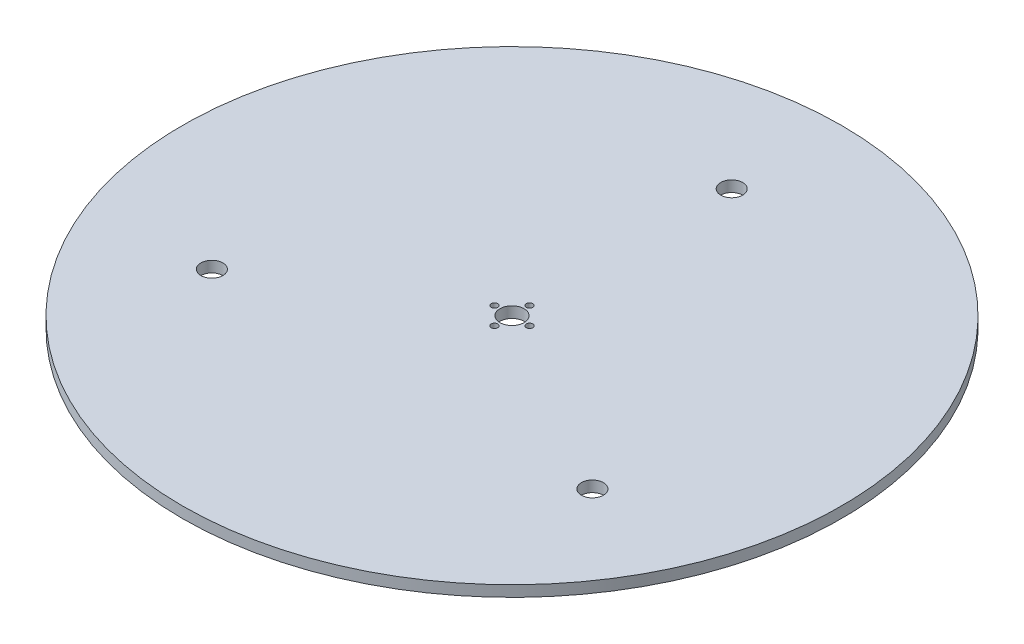
ISO-10303-21;
HEADER;
FILE_DESCRIPTION(('STEP AP214'),'2;1');
FILE_NAME('part.step','',(''),(''),'','','');
FILE_SCHEMA(('AUTOMOTIVE_DESIGN { 1 0 10303 214 1 1 1 1 }'));
ENDSEC;
DATA;
#1=APPLICATION_CONTEXT('core data for automotive mechanical design processes');
#2=APPLICATION_PROTOCOL_DEFINITION('international standard','automotive_design',2000,#1);
#3=PRODUCT_CONTEXT('',#1,'mechanical');
#4=PRODUCT('Part','Part','',(#3));
#5=PRODUCT_RELATED_PRODUCT_CATEGORY('part','',(#4));
#6=PRODUCT_DEFINITION_FORMATION('','',#4);
#7=PRODUCT_DEFINITION_CONTEXT('part definition',#1,'design');
#8=PRODUCT_DEFINITION('design','',#6,#7);
#9=PRODUCT_DEFINITION_SHAPE('','',#8);
#10=(LENGTH_UNIT() NAMED_UNIT(*) SI_UNIT(.MILLI.,.METRE.));
#11=(NAMED_UNIT(*) PLANE_ANGLE_UNIT() SI_UNIT($,.RADIAN.));
#12=(NAMED_UNIT(*) SI_UNIT($,.STERADIAN.) SOLID_ANGLE_UNIT());
#13=UNCERTAINTY_MEASURE_WITH_UNIT(LENGTH_MEASURE(1.E-05),#10,'distance_accuracy_value','');
#14=(GEOMETRIC_REPRESENTATION_CONTEXT(3) GLOBAL_UNCERTAINTY_ASSIGNED_CONTEXT((#13)) GLOBAL_UNIT_ASSIGNED_CONTEXT((#10,
#11,#12)) REPRESENTATION_CONTEXT('',''));
#15=CARTESIAN_POINT('',(0.,0.,0.));
#16=DIRECTION('',(0.,0.,1.));
#17=DIRECTION('',(1.,0.,0.));
#18=AXIS2_PLACEMENT_3D('',#15,#16,#17);
#19=CARTESIAN_POINT('',(0.,5.,0.));
#20=DIRECTION('',(0.,1.,0.));
#21=DIRECTION('',(0.,0.,1.));
#22=AXIS2_PLACEMENT_3D('',#19,#20,#21);
#23=PLANE('',#22);
#24=CARTESIAN_POINT('',(0.,5.,8.));
#25=DIRECTION('',(0.,1.,0.));
#26=DIRECTION('',(0.,0.,1.));
#27=AXIS2_PLACEMENT_3D('',#24,#25,#26);
#28=CIRCLE('',#27,1.5);
#29=CARTESIAN_POINT('',(0.,5.,9.5));
#30=VERTEX_POINT('',#29);
#31=EDGE_CURVE('E96',#30,#30,#28,.T.);
#32=ORIENTED_EDGE('',*,*,#31,.F.);
#33=EDGE_LOOP('',(#32));
#34=FACE_BOUND('',#33,.T.);
#35=CARTESIAN_POINT('',(86.602540378444,5.,49.9999999999998));
#36=DIRECTION('',(0.,1.,0.));
#37=DIRECTION('',(0.,0.,1.));
#38=AXIS2_PLACEMENT_3D('',#35,#36,#37);
#39=CIRCLE('',#38,5.00000000000001);
#40=CARTESIAN_POINT('',(86.602540378444,5.,54.9999999999998));
#41=VERTEX_POINT('',#40);
#42=EDGE_CURVE('E80',#41,#41,#39,.T.);
#43=ORIENTED_EDGE('',*,*,#42,.F.);
#44=EDGE_LOOP('',(#43));
#45=FACE_BOUND('',#44,.T.);
#46=CARTESIAN_POINT('',(0.,5.,-100.));
#47=DIRECTION('',(0.,1.,0.));
#48=DIRECTION('',(0.,0.,1.));
#49=AXIS2_PLACEMENT_3D('',#46,#47,#48);
#50=CIRCLE('',#49,5.);
#51=CARTESIAN_POINT('',(0.,5.,-95.));
#52=VERTEX_POINT('',#51);
#53=EDGE_CURVE('E64',#52,#52,#50,.T.);
#54=ORIENTED_EDGE('',*,*,#53,.F.);
#55=EDGE_LOOP('',(#54));
#56=FACE_BOUND('',#55,.T.);
#57=CARTESIAN_POINT('',(0.,5.,0.));
#58=DIRECTION('',(0.,1.,0.));
#59=DIRECTION('',(0.,0.,1.));
#60=AXIS2_PLACEMENT_3D('',#57,#58,#59);
#61=CIRCLE('',#60,5.5);
#62=CARTESIAN_POINT('',(0.,5.,5.5));
#63=VERTEX_POINT('',#62);
#64=EDGE_CURVE('E50',#63,#63,#61,.T.);
#65=ORIENTED_EDGE('',*,*,#64,.F.);
#66=EDGE_LOOP('',(#65));
#67=FACE_BOUND('',#66,.T.);
#68=CARTESIAN_POINT('',(0.,5.,0.));
#69=DIRECTION('',(0.,1.,0.));
#70=DIRECTION('',(0.,0.,1.));
#71=AXIS2_PLACEMENT_3D('',#68,#69,#70);
#72=CIRCLE('',#71,150.);
#73=CARTESIAN_POINT('',(0.,5.,150.));
#74=VERTEX_POINT('',#73);
#75=EDGE_CURVE('E10',#74,#74,#72,.T.);
#76=ORIENTED_EDGE('',*,*,#75,.T.);
#77=EDGE_LOOP('',(#76));
#78=FACE_BOUND('',#77,.T.);
#79=CARTESIAN_POINT('',(0.,5.,-8.));
#80=DIRECTION('',(0.,1.,0.));
#81=DIRECTION('',(0.,0.,1.));
#82=AXIS2_PLACEMENT_3D('',#79,#80,#81);
#83=CIRCLE('',#82,1.5);
#84=CARTESIAN_POINT('',(0.,5.,-6.5));
#85=VERTEX_POINT('',#84);
#86=EDGE_CURVE('E56',#85,#85,#83,.T.);
#87=ORIENTED_EDGE('',*,*,#86,.F.);
#88=EDGE_LOOP('',(#87));
#89=FACE_BOUND('',#88,.T.);
#90=CARTESIAN_POINT('',(-86.6025403784436,5.,50.0000000000005));
#91=DIRECTION('',(0.,1.,0.));
#92=DIRECTION('',(0.,0.,1.));
#93=AXIS2_PLACEMENT_3D('',#90,#91,#92);
#94=CIRCLE('',#93,5.00000000000001);
#95=CARTESIAN_POINT('',(-86.6025403784436,5.,55.0000000000005));
#96=VERTEX_POINT('',#95);
#97=EDGE_CURVE('E72',#96,#96,#94,.T.);
#98=ORIENTED_EDGE('',*,*,#97,.F.);
#99=EDGE_LOOP('',(#98));
#100=FACE_BOUND('',#99,.T.);
#101=CARTESIAN_POINT('',(8.,5.,0.));
#102=DIRECTION('',(0.,1.,0.));
#103=DIRECTION('',(0.,0.,1.));
#104=AXIS2_PLACEMENT_3D('',#101,#102,#103);
#105=CIRCLE('',#104,1.5);
#106=CARTESIAN_POINT('',(8.,5.,1.50000000000003));
#107=VERTEX_POINT('',#106);
#108=EDGE_CURVE('E88',#107,#107,#105,.T.);
#109=ORIENTED_EDGE('',*,*,#108,.F.);
#110=EDGE_LOOP('',(#109));
#111=FACE_BOUND('',#110,.T.);
#112=CARTESIAN_POINT('',(-8.,5.,0.));
#113=DIRECTION('',(0.,1.,0.));
#114=DIRECTION('',(0.,0.,1.));
#115=AXIS2_PLACEMENT_3D('',#112,#113,#114);
#116=CIRCLE('',#115,1.5);
#117=CARTESIAN_POINT('',(-8.,5.,1.49999999999992));
#118=VERTEX_POINT('',#117);
#119=EDGE_CURVE('E104',#118,#118,#116,.T.);
#120=ORIENTED_EDGE('',*,*,#119,.F.);
#121=EDGE_LOOP('',(#120));
#122=FACE_BOUND('',#121,.T.);
#123=ADVANCED_FACE('F37',(#34,#45,#56,#67,#78,#89,#100,#111,#122),#23,.T.);
#124=CARTESIAN_POINT('',(0.,0.,0.));
#125=DIRECTION('',(0.,1.,0.));
#126=DIRECTION('',(0.,0.,1.));
#127=AXIS2_PLACEMENT_3D('',#124,#125,#126);
#128=PLANE('',#127);
#129=CARTESIAN_POINT('',(0.,0.,0.));
#130=DIRECTION('',(0.,1.,0.));
#131=DIRECTION('',(0.,0.,1.));
#132=AXIS2_PLACEMENT_3D('',#129,#130,#131);
#133=CIRCLE('',#132,150.);
#134=CARTESIAN_POINT('',(0.,0.,150.));
#135=VERTEX_POINT('',#134);
#136=EDGE_CURVE('E41',#135,#135,#133,.T.);
#137=ORIENTED_EDGE('',*,*,#136,.F.);
#138=EDGE_LOOP('',(#137));
#139=FACE_BOUND('',#138,.T.);
#140=CARTESIAN_POINT('',(0.,0.,0.));
#141=DIRECTION('',(0.,1.,0.));
#142=DIRECTION('',(0.,0.,1.));
#143=AXIS2_PLACEMENT_3D('',#140,#141,#142);
#144=CIRCLE('',#143,5.5);
#145=CARTESIAN_POINT('',(0.,0.,5.5));
#146=VERTEX_POINT('',#145);
#147=EDGE_CURVE('E52',#146,#146,#144,.T.);
#148=ORIENTED_EDGE('',*,*,#147,.T.);
#149=EDGE_LOOP('',(#148));
#150=FACE_BOUND('',#149,.T.);
#151=CARTESIAN_POINT('',(0.,0.,-8.));
#152=DIRECTION('',(0.,1.,0.));
#153=DIRECTION('',(0.,0.,1.));
#154=AXIS2_PLACEMENT_3D('',#151,#152,#153);
#155=CIRCLE('',#154,1.5);
#156=CARTESIAN_POINT('',(0.,0.,-6.5));
#157=VERTEX_POINT('',#156);
#158=EDGE_CURVE('E60',#157,#157,#155,.T.);
#159=ORIENTED_EDGE('',*,*,#158,.T.);
#160=EDGE_LOOP('',(#159));
#161=FACE_BOUND('',#160,.T.);
#162=CARTESIAN_POINT('',(0.,0.,-100.));
#163=DIRECTION('',(0.,1.,0.));
#164=DIRECTION('',(0.,0.,1.));
#165=AXIS2_PLACEMENT_3D('',#162,#163,#164);
#166=CIRCLE('',#165,5.);
#167=CARTESIAN_POINT('',(0.,0.,-95.));
#168=VERTEX_POINT('',#167);
#169=EDGE_CURVE('E68',#168,#168,#166,.T.);
#170=ORIENTED_EDGE('',*,*,#169,.T.);
#171=EDGE_LOOP('',(#170));
#172=FACE_BOUND('',#171,.T.);
#173=CARTESIAN_POINT('',(-86.6025403784436,0.,50.0000000000005));
#174=DIRECTION('',(0.,1.,0.));
#175=DIRECTION('',(0.,0.,1.));
#176=AXIS2_PLACEMENT_3D('',#173,#174,#175);
#177=CIRCLE('',#176,5.00000000000001);
#178=CARTESIAN_POINT('',(-86.6025403784436,0.,55.0000000000005));
#179=VERTEX_POINT('',#178);
#180=EDGE_CURVE('E76',#179,#179,#177,.T.);
#181=ORIENTED_EDGE('',*,*,#180,.T.);
#182=EDGE_LOOP('',(#181));
#183=FACE_BOUND('',#182,.T.);
#184=CARTESIAN_POINT('',(86.602540378444,0.,49.9999999999998));
#185=DIRECTION('',(0.,1.,0.));
#186=DIRECTION('',(0.,0.,1.));
#187=AXIS2_PLACEMENT_3D('',#184,#185,#186);
#188=CIRCLE('',#187,5.00000000000001);
#189=CARTESIAN_POINT('',(86.602540378444,0.,54.9999999999998));
#190=VERTEX_POINT('',#189);
#191=EDGE_CURVE('E84',#190,#190,#188,.T.);
#192=ORIENTED_EDGE('',*,*,#191,.T.);
#193=EDGE_LOOP('',(#192));
#194=FACE_BOUND('',#193,.T.);
#195=CARTESIAN_POINT('',(8.,0.,0.));
#196=DIRECTION('',(0.,1.,0.));
#197=DIRECTION('',(0.,0.,1.));
#198=AXIS2_PLACEMENT_3D('',#195,#196,#197);
#199=CIRCLE('',#198,1.5);
#200=CARTESIAN_POINT('',(8.,0.,1.50000000000003));
#201=VERTEX_POINT('',#200);
#202=EDGE_CURVE('E92',#201,#201,#199,.T.);
#203=ORIENTED_EDGE('',*,*,#202,.T.);
#204=EDGE_LOOP('',(#203));
#205=FACE_BOUND('',#204,.T.);
#206=CARTESIAN_POINT('',(0.,0.,8.));
#207=DIRECTION('',(0.,1.,0.));
#208=DIRECTION('',(0.,0.,1.));
#209=AXIS2_PLACEMENT_3D('',#206,#207,#208);
#210=CIRCLE('',#209,1.5);
#211=CARTESIAN_POINT('',(0.,0.,9.5));
#212=VERTEX_POINT('',#211);
#213=EDGE_CURVE('E100',#212,#212,#210,.T.);
#214=ORIENTED_EDGE('',*,*,#213,.T.);
#215=EDGE_LOOP('',(#214));
#216=FACE_BOUND('',#215,.T.);
#217=CARTESIAN_POINT('',(-8.,0.,0.));
#218=DIRECTION('',(0.,1.,0.));
#219=DIRECTION('',(0.,0.,1.));
#220=AXIS2_PLACEMENT_3D('',#217,#218,#219);
#221=CIRCLE('',#220,1.5);
#222=CARTESIAN_POINT('',(-8.,0.,1.49999999999992));
#223=VERTEX_POINT('',#222);
#224=EDGE_CURVE('E108',#223,#223,#221,.T.);
#225=ORIENTED_EDGE('',*,*,#224,.T.);
#226=EDGE_LOOP('',(#225));
#227=FACE_BOUND('',#226,.T.);
#228=ADVANCED_FACE('F120',(#139,#150,#161,#172,#183,#194,#205,#216,#227),#128,.F.);
#229=CARTESIAN_POINT('',(0.,5.,0.));
#230=DIRECTION('',(0.,-1.,0.));
#231=DIRECTION('',(0.,0.,-1.));
#232=AXIS2_PLACEMENT_3D('',#229,#230,#231);
#233=CYLINDRICAL_SURFACE('',#232,150.);
#234=ORIENTED_EDGE('',*,*,#75,.F.);
#235=EDGE_LOOP('',(#234));
#236=FACE_BOUND('',#235,.T.);
#237=ORIENTED_EDGE('',*,*,#136,.T.);
#238=EDGE_LOOP('',(#237));
#239=FACE_BOUND('',#238,.T.);
#240=ADVANCED_FACE('F39',(#236,#239),#233,.T.);
#241=CARTESIAN_POINT('',(0.,5.,0.));
#242=DIRECTION('',(0.,-1.,0.));
#243=DIRECTION('',(0.,0.,-1.));
#244=AXIS2_PLACEMENT_3D('',#241,#242,#243);
#245=CYLINDRICAL_SURFACE('',#244,5.5);
#246=ORIENTED_EDGE('',*,*,#64,.T.);
#247=EDGE_LOOP('',(#246));
#248=FACE_BOUND('',#247,.T.);
#249=ORIENTED_EDGE('',*,*,#147,.F.);
#250=EDGE_LOOP('',(#249));
#251=FACE_BOUND('',#250,.T.);
#252=ADVANCED_FACE('F130',(#248,#251),#245,.F.);
#253=CARTESIAN_POINT('',(0.,5.,-8.));
#254=DIRECTION('',(0.,-1.,0.));
#255=DIRECTION('',(0.,0.,-1.));
#256=AXIS2_PLACEMENT_3D('',#253,#254,#255);
#257=CYLINDRICAL_SURFACE('',#256,1.5);
#258=ORIENTED_EDGE('',*,*,#86,.T.);
#259=EDGE_LOOP('',(#258));
#260=FACE_BOUND('',#259,.T.);
#261=ORIENTED_EDGE('',*,*,#158,.F.);
#262=EDGE_LOOP('',(#261));
#263=FACE_BOUND('',#262,.T.);
#264=ADVANCED_FACE('F133',(#260,#263),#257,.F.);
#265=CARTESIAN_POINT('',(0.,5.,-100.));
#266=DIRECTION('',(0.,-1.,0.));
#267=DIRECTION('',(0.,0.,-1.));
#268=AXIS2_PLACEMENT_3D('',#265,#266,#267);
#269=CYLINDRICAL_SURFACE('',#268,5.);
#270=ORIENTED_EDGE('',*,*,#53,.T.);
#271=EDGE_LOOP('',(#270));
#272=FACE_BOUND('',#271,.T.);
#273=ORIENTED_EDGE('',*,*,#169,.F.);
#274=EDGE_LOOP('',(#273));
#275=FACE_BOUND('',#274,.T.);
#276=ADVANCED_FACE('F137',(#272,#275),#269,.F.);
#277=CARTESIAN_POINT('',(-86.6025403784436,5.,50.0000000000005));
#278=DIRECTION('',(0.,-1.,0.));
#279=DIRECTION('',(0.,0.,-1.));
#280=AXIS2_PLACEMENT_3D('',#277,#278,#279);
#281=CYLINDRICAL_SURFACE('',#280,5.00000000000001);
#282=ORIENTED_EDGE('',*,*,#97,.T.);
#283=EDGE_LOOP('',(#282));
#284=FACE_BOUND('',#283,.T.);
#285=ORIENTED_EDGE('',*,*,#180,.F.);
#286=EDGE_LOOP('',(#285));
#287=FACE_BOUND('',#286,.T.);
#288=ADVANCED_FACE('F141',(#284,#287),#281,.F.);
#289=CARTESIAN_POINT('',(86.602540378444,5.,49.9999999999998));
#290=DIRECTION('',(0.,-1.,0.));
#291=DIRECTION('',(0.,0.,-1.));
#292=AXIS2_PLACEMENT_3D('',#289,#290,#291);
#293=CYLINDRICAL_SURFACE('',#292,5.00000000000001);
#294=ORIENTED_EDGE('',*,*,#42,.T.);
#295=EDGE_LOOP('',(#294));
#296=FACE_BOUND('',#295,.T.);
#297=ORIENTED_EDGE('',*,*,#191,.F.);
#298=EDGE_LOOP('',(#297));
#299=FACE_BOUND('',#298,.T.);
#300=ADVANCED_FACE('F145',(#296,#299),#293,.F.);
#301=CARTESIAN_POINT('',(8.,5.,0.));
#302=DIRECTION('',(0.,-1.,0.));
#303=DIRECTION('',(0.,0.,-1.));
#304=AXIS2_PLACEMENT_3D('',#301,#302,#303);
#305=CYLINDRICAL_SURFACE('',#304,1.5);
#306=ORIENTED_EDGE('',*,*,#108,.T.);
#307=EDGE_LOOP('',(#306));
#308=FACE_BOUND('',#307,.T.);
#309=ORIENTED_EDGE('',*,*,#202,.F.);
#310=EDGE_LOOP('',(#309));
#311=FACE_BOUND('',#310,.T.);
#312=ADVANCED_FACE('F149',(#308,#311),#305,.F.);
#313=CARTESIAN_POINT('',(0.,5.,8.));
#314=DIRECTION('',(0.,-1.,0.));
#315=DIRECTION('',(0.,0.,-1.));
#316=AXIS2_PLACEMENT_3D('',#313,#314,#315);
#317=CYLINDRICAL_SURFACE('',#316,1.5);
#318=ORIENTED_EDGE('',*,*,#31,.T.);
#319=EDGE_LOOP('',(#318));
#320=FACE_BOUND('',#319,.T.);
#321=ORIENTED_EDGE('',*,*,#213,.F.);
#322=EDGE_LOOP('',(#321));
#323=FACE_BOUND('',#322,.T.);
#324=ADVANCED_FACE('F153',(#320,#323),#317,.F.);
#325=CARTESIAN_POINT('',(-8.,5.,0.));
#326=DIRECTION('',(0.,-1.,0.));
#327=DIRECTION('',(0.,0.,-1.));
#328=AXIS2_PLACEMENT_3D('',#325,#326,#327);
#329=CYLINDRICAL_SURFACE('',#328,1.5);
#330=ORIENTED_EDGE('',*,*,#119,.T.);
#331=EDGE_LOOP('',(#330));
#332=FACE_BOUND('',#331,.T.);
#333=ORIENTED_EDGE('',*,*,#224,.F.);
#334=EDGE_LOOP('',(#333));
#335=FACE_BOUND('',#334,.T.);
#336=ADVANCED_FACE('F116',(#332,#335),#329,.F.);
#337=CLOSED_SHELL('',(#123,#228,#240,#252,#264,#276,#288,#300,#312,#324,#336));
#338=MANIFOLD_SOLID_BREP('B2',#337);
#339=ADVANCED_BREP_SHAPE_REPRESENTATION('',(#18,#338),#14);
#340=SHAPE_DEFINITION_REPRESENTATION(#9,#339);
ENDSEC;
END-ISO-10303-21;
